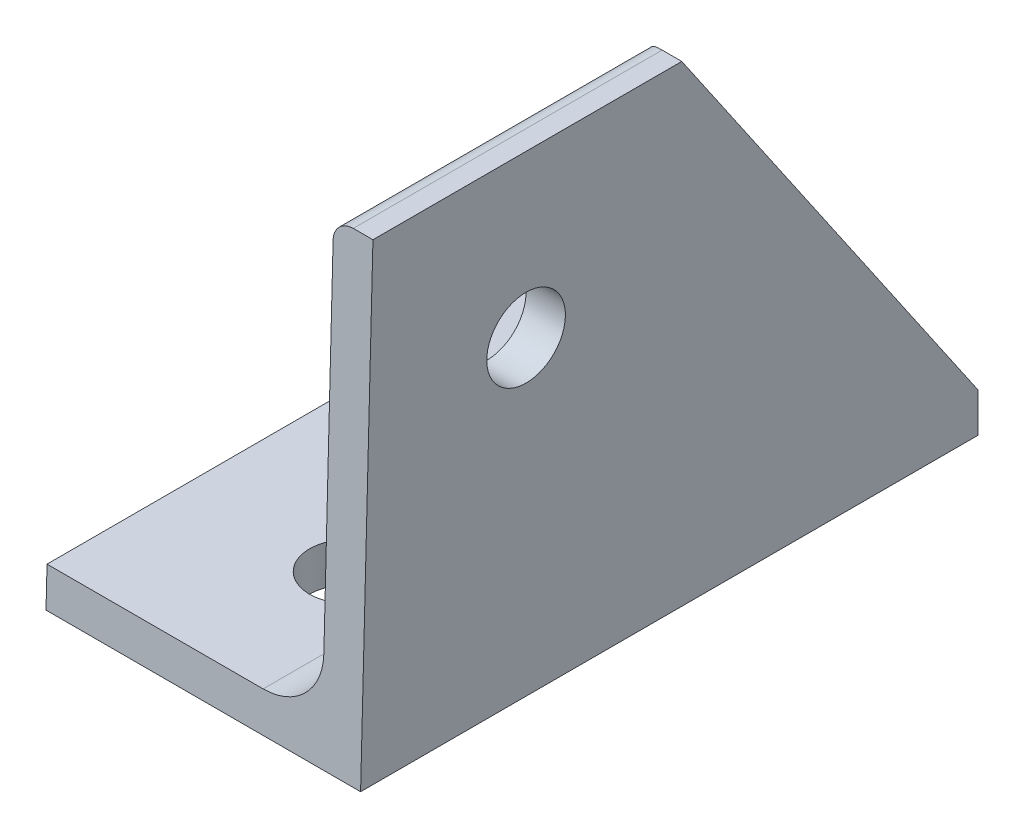
ISO-10303-21;
HEADER;
FILE_DESCRIPTION(('STEP AP214'),'2;1');
FILE_NAME('part.step','',(''),(''),'','','');
FILE_SCHEMA(('AUTOMOTIVE_DESIGN { 1 0 10303 214 1 1 1 1 }'));
ENDSEC;
DATA;
#1=APPLICATION_CONTEXT('core data for automotive mechanical design processes');
#2=APPLICATION_PROTOCOL_DEFINITION('international standard','automotive_design',2000,#1);
#3=PRODUCT_CONTEXT('',#1,'mechanical');
#4=PRODUCT('Part','Part','',(#3));
#5=PRODUCT_RELATED_PRODUCT_CATEGORY('part','',(#4));
#6=PRODUCT_DEFINITION_FORMATION('','',#4);
#7=PRODUCT_DEFINITION_CONTEXT('part definition',#1,'design');
#8=PRODUCT_DEFINITION('design','',#6,#7);
#9=PRODUCT_DEFINITION_SHAPE('','',#8);
#10=(LENGTH_UNIT() NAMED_UNIT(*) SI_UNIT(.MILLI.,.METRE.));
#11=(NAMED_UNIT(*) PLANE_ANGLE_UNIT() SI_UNIT($,.RADIAN.));
#12=(NAMED_UNIT(*) SI_UNIT($,.STERADIAN.) SOLID_ANGLE_UNIT());
#13=UNCERTAINTY_MEASURE_WITH_UNIT(LENGTH_MEASURE(1.E-05),#10,'distance_accuracy_value','');
#14=(GEOMETRIC_REPRESENTATION_CONTEXT(3) GLOBAL_UNCERTAINTY_ASSIGNED_CONTEXT((#13)) GLOBAL_UNIT_ASSIGNED_CONTEXT((#10,
#11,#12)) REPRESENTATION_CONTEXT('',''));
#15=CARTESIAN_POINT('',(0.,0.,0.));
#16=DIRECTION('',(0.,0.,1.));
#17=DIRECTION('',(1.,0.,0.));
#18=AXIS2_PLACEMENT_3D('',#15,#16,#17);
#19=CARTESIAN_POINT('',(11.0998,-11.0998,25.4));
#20=DIRECTION('',(0.,0.,-1.));
#21=DIRECTION('',(-1.,0.,0.));
#22=AXIS2_PLACEMENT_3D('',#19,#20,#21);
#23=CYLINDRICAL_SURFACE('',#22,4.7752);
#24=CARTESIAN_POINT('',(11.0998,-15.875,-8.48551308460921));
#25=CARTESIAN_POINT('',(11.2357111678711,-15.8749607958703,-8.63863271083802));
#26=CARTESIAN_POINT('',(11.3640476477458,-15.8691996849909,-8.79823988287183));
#27=CARTESIAN_POINT('',(11.6044683584301,-15.8497967345363,-9.1286363206387));
#28=CARTESIAN_POINT('',(11.7165661058063,-15.8361614968117,-9.29941611275704));
#29=CARTESIAN_POINT('',(11.9236350085392,-15.8045617726995,-9.6506226799802));
#30=CARTESIAN_POINT('',(12.0186065582862,-15.7865973860279,-9.83104923281066));
#31=CARTESIAN_POINT('',(12.1907600045839,-15.7495425805541,-10.200107193315));
#32=CARTESIAN_POINT('',(12.2679412301489,-15.7304521193145,-10.3887389101386));
#33=CARTESIAN_POINT('',(12.3936213817966,-15.6967691857035,-10.7437138738769));
#34=CARTESIAN_POINT('',(12.4446903479384,-15.6819325225662,-10.9091292576411));
#35=CARTESIAN_POINT('',(12.5331929373582,-15.6550238870502,-11.2437825028225));
#36=CARTESIAN_POINT('',(12.5706282886737,-15.6429515643681,-11.4130198769191));
#37=CARTESIAN_POINT('',(12.6315035505426,-15.6227910942342,-11.7538881871343));
#38=CARTESIAN_POINT('',(12.6549708905553,-15.61469514375,-11.9255137503194));
#39=CARTESIAN_POINT('',(12.6878086575615,-15.6032507410658,-12.2702747659042));
#40=CARTESIAN_POINT('',(12.6971788470998,-15.5999023688349,-12.4434102436877));
#41=CARTESIAN_POINT('',(12.7017270775053,-15.5982853959638,-12.7898914718866));
#42=CARTESIAN_POINT('',(12.696905158404,-15.6000167809953,-12.9632372217074));
#43=CARTESIAN_POINT('',(12.6731181320052,-15.6083875972335,-13.3088349201236));
#44=CARTESIAN_POINT('',(12.6541527733028,-15.6150271156843,-13.4810868492209));
#45=CARTESIAN_POINT('',(12.6022138991968,-15.6325736391906,-13.8235538234178));
#46=CARTESIAN_POINT('',(12.5692153438454,-15.6434882697233,-13.9937646656111));
#47=CARTESIAN_POINT('',(12.4894888602921,-15.6685023777956,-14.3306891970083));
#48=CARTESIAN_POINT('',(12.4427611726205,-15.6826017995377,-14.4974029474254));
#49=CARTESIAN_POINT('',(12.3363262194501,-15.7124527944421,-14.8250515752677));
#50=CARTESIAN_POINT('',(12.2767211685287,-15.7281908781162,-14.9860209484218));
#51=CARTESIAN_POINT('',(12.144674394576,-15.7597762892197,-15.3026277456028));
#52=CARTESIAN_POINT('',(12.0722305554551,-15.775623634243,-15.458264285618));
#53=CARTESIAN_POINT('',(11.9151029571149,-15.8055620041383,-15.7629127722917));
#54=CARTESIAN_POINT('',(11.8304501317334,-15.8196573049611,-15.9119402526041));
#55=CARTESIAN_POINT('',(11.6492544101474,-15.844163346169,-16.2028173767018));
#56=CARTESIAN_POINT('',(11.5527190491874,-15.8545764055646,-16.3446714897266));
#57=CARTESIAN_POINT('',(11.3952906054384,-15.8661705537528,-16.5569614099106));
#58=CARTESIAN_POINT('',(11.3383913450767,-15.8693951869497,-16.6302750878716));
#59=CARTESIAN_POINT('',(11.2214388928702,-15.8738086580742,-16.7743328150349));
#60=CARTESIAN_POINT('',(11.1613875614351,-15.8749986832437,-16.8450783392082));
#61=CARTESIAN_POINT('',(11.0998,-15.875,-16.9144869153908));
#62=B_SPLINE_CURVE_WITH_KNOTS('',3,(#24,#25,#26,#27,#28,#29,#30,#31,#32,#33,#34,#35,#36,#37,#38,
#39,#40,#41,#42,#43,#44,#45,#46,#47,#48,#49,#50,#51,#52,#53,#54,#55,#56,#57,#58,#59,#60,#61),
.UNSPECIFIED.,.F.,.F.,(4,2,2,2,2,2,2,2,2,2,2,2,2,2,2,2,2,2,4),(0.,0.613649372772355,
1.22678499311274,1.83990649206569,2.45305111192113,2.97374489222339,3.49437265248971,
4.01397463607019,4.53358537183239,5.05319464193575,5.57281314850679,6.09336274560458,
6.61390322337106,7.13045448971822,7.64709097337797,8.16244073380393,8.67746535559926,
8.95594344265795,9.23425897565643),.UNSPECIFIED.);
#63=CARTESIAN_POINT('',(11.0998,-15.875,-8.48551308460923));
#64=VERTEX_POINT('',#63);
#65=CARTESIAN_POINT('',(11.0998,-15.875,-16.9144869153908));
#66=VERTEX_POINT('',#65);
#67=EDGE_CURVE('E125',#64,#66,#62,.T.);
#68=ORIENTED_EDGE('',*,*,#67,.F.);
#69=DIRECTION('',(0.,0.,-1.));
#70=VECTOR('',#69,1.);
#71=CARTESIAN_POINT('',(11.0998,-15.875,25.4));
#72=LINE('',#71,#70);
#73=CARTESIAN_POINT('',(11.0998,-15.875,8.48551308460923));
#74=VERTEX_POINT('',#73);
#75=EDGE_CURVE('E133',#74,#64,#72,.T.);
#76=ORIENTED_EDGE('',*,*,#75,.F.);
#77=CARTESIAN_POINT('',(11.0998,-15.875,16.9144869153908));
#78=CARTESIAN_POINT('',(11.2357111678711,-15.8749607958703,16.761367289162));
#79=CARTESIAN_POINT('',(11.3640476477459,-15.8691996849909,16.6017601171282));
#80=CARTESIAN_POINT('',(11.6044683584301,-15.8497967345363,16.2713636793613));
#81=CARTESIAN_POINT('',(11.7165661058063,-15.8361614968117,16.100583887243));
#82=CARTESIAN_POINT('',(11.9236350085392,-15.8045617726995,15.7493773200198));
#83=CARTESIAN_POINT('',(12.0186065582862,-15.7865973860279,15.5689507671893));
#84=CARTESIAN_POINT('',(12.1907600045839,-15.7495425805541,15.199892806685));
#85=CARTESIAN_POINT('',(12.2679412301489,-15.7304521193145,15.0112610898614));
#86=CARTESIAN_POINT('',(12.3936213817966,-15.6967691857035,14.6562861261231));
#87=CARTESIAN_POINT('',(12.4446903479384,-15.6819325225662,14.4908707423589));
#88=CARTESIAN_POINT('',(12.5331929373582,-15.6550238870502,14.1562174971775));
#89=CARTESIAN_POINT('',(12.5706282886737,-15.6429515643681,13.9869801230809));
#90=CARTESIAN_POINT('',(12.6315035505426,-15.6227910942342,13.6461118128657));
#91=CARTESIAN_POINT('',(12.6549708905553,-15.61469514375,13.4744862496806));
#92=CARTESIAN_POINT('',(12.6878086575615,-15.6032507410658,13.1297252340958));
#93=CARTESIAN_POINT('',(12.6971788470998,-15.5999023688349,12.9565897563123));
#94=CARTESIAN_POINT('',(12.7017270775053,-15.5982853959638,12.6101085281134));
#95=CARTESIAN_POINT('',(12.696905158404,-15.6000167809953,12.4367627782925));
#96=CARTESIAN_POINT('',(12.6731181320052,-15.6083875972335,12.0911650798764));
#97=CARTESIAN_POINT('',(12.6541527733028,-15.6150271156843,11.9189131507791));
#98=CARTESIAN_POINT('',(12.6022138991968,-15.6325736391906,11.5764461765822));
#99=CARTESIAN_POINT('',(12.5692153438454,-15.6434882697233,11.4062353343889));
#100=CARTESIAN_POINT('',(12.4894888602921,-15.6685023777956,11.0693108029917));
#101=CARTESIAN_POINT('',(12.4427611726205,-15.6826017995377,10.9025970525746));
#102=CARTESIAN_POINT('',(12.3363262194501,-15.7124527944421,10.5749484247323));
#103=CARTESIAN_POINT('',(12.2767211685287,-15.7281908781162,10.4139790515782));
#104=CARTESIAN_POINT('',(12.144674394576,-15.7597762892197,10.0973722543972));
#105=CARTESIAN_POINT('',(12.0722305554551,-15.775623634243,9.94173571438202));
#106=CARTESIAN_POINT('',(11.9151029571149,-15.8055620041383,9.63708722770828));
#107=CARTESIAN_POINT('',(11.8304501317333,-15.8196573049611,9.48805974739591));
#108=CARTESIAN_POINT('',(11.6492544101474,-15.844163346169,9.19718262329822));
#109=CARTESIAN_POINT('',(11.5527190491874,-15.8545764055646,9.05532851027338));
#110=CARTESIAN_POINT('',(11.3952906054384,-15.8661705537528,8.84303859008942));
#111=CARTESIAN_POINT('',(11.3383913450767,-15.8693951869497,8.76972491212838));
#112=CARTESIAN_POINT('',(11.2214388928702,-15.8738086580742,8.62566718496507));
#113=CARTESIAN_POINT('',(11.1613875614351,-15.8749986832437,8.55492166079179));
#114=CARTESIAN_POINT('',(11.0998,-15.875,8.48551308460922));
#115=B_SPLINE_CURVE_WITH_KNOTS('',3,(#77,#78,#79,#80,#81,#82,#83,#84,#85,#86,#87,#88,#89,#90,
#91,#92,#93,#94,#95,#96,#97,#98,#99,#100,#101,#102,#103,#104,#105,#106,#107,#108,#109,#110,#111,
#112,#113,#114),.UNSPECIFIED.,.F.,.F.,(4,2,2,2,2,2,2,2,2,2,2,2,2,2,2,2,2,2,4),(0.,
0.613649372772355,1.22678499311274,1.83990649206569,2.45305111192113,2.97374489222339,
3.49437265248971,4.01397463607019,4.53358537183239,5.05319464193575,5.57281314850679,
6.09336274560458,6.61390322337106,7.13045448971822,7.64709097337797,8.16244073380393,
8.67746535559927,8.95594344265795,9.23425897565643),.UNSPECIFIED.);
#116=CARTESIAN_POINT('',(11.0998,-15.875,16.9144869153908));
#117=VERTEX_POINT('',#116);
#118=EDGE_CURVE('E128',#117,#74,#115,.T.);
#119=ORIENTED_EDGE('',*,*,#118,.F.);
#120=CARTESIAN_POINT('',(11.0998,-15.875,24.3663781368268));
#121=VERTEX_POINT('',#120);
#122=EDGE_CURVE('E142',#121,#117,#72,.T.);
#123=ORIENTED_EDGE('',*,*,#122,.F.);
#124=CARTESIAN_POINT('',(11.0998,-11.0998,24.241335124149));
#125=DIRECTION('',(0.,0.0261769483079955,0.999657324975554));
#126=DIRECTION('',(0.,0.999657324975554,-0.0261769483079955));
#127=AXIS2_PLACEMENT_3D('',#124,#125,#126);
#128=ELLIPSE('',#127,4.77683690270241,4.7752);
#129=CARTESIAN_POINT('',(15.875,-11.0998,24.241335124149));
#130=VERTEX_POINT('',#129);
#131=EDGE_CURVE('E224',#130,#121,#128,.F.);
#132=ORIENTED_EDGE('',*,*,#131,.F.);
#133=DIRECTION('',(0.,0.,-1.));
#134=VECTOR('',#133,1.);
#135=CARTESIAN_POINT('',(15.875,-11.0998,25.4));
#136=LINE('',#135,#134);
#137=CARTESIAN_POINT('',(15.875,-11.0998,-22.130051963795));
#138=VERTEX_POINT('',#137);
#139=EDGE_CURVE('E146',#130,#138,#136,.T.);
#140=ORIENTED_EDGE('',*,*,#139,.T.);
#141=CARTESIAN_POINT('',(11.0998,-11.0998,-22.130051963795));
#142=DIRECTION('',(0.,0.565002335416394,-0.825089304847675));
#143=DIRECTION('',(0.,-0.825089304847675,-0.565002335416394));
#144=AXIS2_PLACEMENT_3D('',#141,#142,#143);
#145=ELLIPSE('',#144,5.78749472565467,4.7752);
#146=CARTESIAN_POINT('',(11.0998,-15.875,-25.4));
#147=VERTEX_POINT('',#146);
#148=EDGE_CURVE('E215',#147,#138,#145,.F.);
#149=ORIENTED_EDGE('',*,*,#148,.F.);
#150=EDGE_CURVE('E135',#66,#147,#72,.T.);
#151=ORIENTED_EDGE('',*,*,#150,.F.);
#152=EDGE_LOOP('',(#68,#76,#119,#123,#132,#140,#149,#151));
#153=FACE_BOUND('',#152,.T.);
#154=ADVANCED_FACE('F45',(#153),#23,.F.);
#155=CARTESIAN_POINT('',(-19.05,-19.05,25.4));
#156=DIRECTION('',(0.,1.,0.));
#157=DIRECTION('',(-1.,0.,0.));
#158=AXIS2_PLACEMENT_3D('',#155,#156,#157);
#159=PLANE('',#158);
#160=CARTESIAN_POINT('',(6.35000000000001,-19.05,12.7));
#161=DIRECTION('',(0.,-1.,0.));
#162=DIRECTION('',(1.,0.,0.));
#163=AXIS2_PLACEMENT_3D('',#160,#161,#162);
#164=CIRCLE('',#163,3.175);
#165=CARTESIAN_POINT('',(9.52500000000001,-19.05,12.7));
#166=VERTEX_POINT('',#165);
#167=EDGE_CURVE('E197',#166,#166,#164,.T.);
#168=ORIENTED_EDGE('',*,*,#167,.F.);
#169=EDGE_LOOP('',(#168));
#170=FACE_BOUND('',#169,.T.);
#171=CARTESIAN_POINT('',(6.35000000000001,-19.05,-12.7));
#172=DIRECTION('',(0.,-1.,0.));
#173=DIRECTION('',(1.,0.,0.));
#174=AXIS2_PLACEMENT_3D('',#171,#172,#173);
#175=CIRCLE('',#174,3.175);
#176=CARTESIAN_POINT('',(9.52500000000001,-19.05,-12.7));
#177=VERTEX_POINT('',#176);
#178=EDGE_CURVE('E201',#177,#177,#175,.T.);
#179=ORIENTED_EDGE('',*,*,#178,.F.);
#180=EDGE_LOOP('',(#179));
#181=FACE_BOUND('',#180,.T.);
#182=DIRECTION('',(1.,0.,0.));
#183=VECTOR('',#182,1.);
#184=CARTESIAN_POINT('',(-6.35,-19.05,24.4495184378094));
#185=LINE('',#184,#183);
#186=CARTESIAN_POINT('',(-6.35,-19.05,24.4495184378094));
#187=VERTEX_POINT('',#186);
#188=CARTESIAN_POINT('',(19.05,-19.05,24.4495184378094));
#189=VERTEX_POINT('',#188);
#190=EDGE_CURVE('E239',#187,#189,#185,.T.);
#191=ORIENTED_EDGE('',*,*,#190,.F.);
#192=DIRECTION('',(0.,0.,1.));
#193=VECTOR('',#192,1.);
#194=CARTESIAN_POINT('',(-6.35,-19.05,25.4));
#195=LINE('',#194,#193);
#196=CARTESIAN_POINT('',(-6.34999999999999,-19.05,-25.4));
#197=VERTEX_POINT('',#196);
#198=EDGE_CURVE('E202',#197,#187,#195,.T.);
#199=ORIENTED_EDGE('',*,*,#198,.F.);
#200=DIRECTION('',(1.,0.,0.));
#201=VECTOR('',#200,1.);
#202=CARTESIAN_POINT('',(-19.05,-19.05,-25.4));
#203=LINE('',#202,#201);
#204=CARTESIAN_POINT('',(19.05,-19.05,-25.4));
#205=VERTEX_POINT('',#204);
#206=EDGE_CURVE('E179',#197,#205,#203,.T.);
#207=ORIENTED_EDGE('',*,*,#206,.T.);
#208=DIRECTION('',(0.,0.,-1.));
#209=VECTOR('',#208,1.);
#210=CARTESIAN_POINT('',(19.05,-19.05,25.4));
#211=LINE('',#210,#209);
#212=EDGE_CURVE('E166',#189,#205,#211,.T.);
#213=ORIENTED_EDGE('',*,*,#212,.F.);
#214=EDGE_LOOP('',(#191,#199,#207,#213));
#215=FACE_BOUND('',#214,.T.);
#216=ADVANCED_FACE('F47',(#170,#181,#215),#159,.F.);
#217=CARTESIAN_POINT('',(19.05,-19.05,25.4));
#218=DIRECTION('',(-1.,0.,0.));
#219=DIRECTION('',(0.,-1.,0.));
#220=AXIS2_PLACEMENT_3D('',#217,#218,#219);
#221=PLANE('',#220);
#222=CARTESIAN_POINT('',(19.05,6.02190472929893,11.0886340423407));
#223=DIRECTION('',(1.,0.,0.));
#224=DIRECTION('',(0.,1.,0.));
#225=AXIS2_PLACEMENT_3D('',#222,#223,#224);
#226=CIRCLE('',#225,3.175);
#227=CARTESIAN_POINT('',(19.05,9.19690472929893,11.0886340423407));
#228=VERTEX_POINT('',#227);
#229=EDGE_CURVE('E137',#228,#228,#226,.T.);
#230=ORIENTED_EDGE('',*,*,#229,.F.);
#231=EDGE_LOOP('',(#230));
#232=FACE_BOUND('',#231,.T.);
#233=DIRECTION('',(0.,0.825089304847675,0.565002335416394));
#234=VECTOR('',#233,1.);
#235=CARTESIAN_POINT('',(19.05,19.05,-1.48415665009674));
#236=LINE('',#235,#234);
#237=CARTESIAN_POINT('',(19.05,-15.875,-25.4));
#238=VERTEX_POINT('',#237);
#239=CARTESIAN_POINT('',(19.05,19.05,-1.48415665009674));
#240=VERTEX_POINT('',#239);
#241=EDGE_CURVE('E248',#238,#240,#236,.T.);
#242=ORIENTED_EDGE('',*,*,#241,.T.);
#243=DIRECTION('',(0.,0.,-1.));
#244=VECTOR('',#243,1.);
#245=CARTESIAN_POINT('',(19.05,19.05,25.4));
#246=LINE('',#245,#244);
#247=CARTESIAN_POINT('',(19.05,19.05,23.4518348260187));
#248=VERTEX_POINT('',#247);
#249=EDGE_CURVE('E162',#248,#240,#246,.T.);
#250=ORIENTED_EDGE('',*,*,#249,.F.);
#251=DIRECTION('',(0.,-0.999657324975554,0.0261769483079955));
#252=VECTOR('',#251,1.);
#253=CARTESIAN_POINT('',(19.05,19.05,23.4518348260187));
#254=LINE('',#253,#252);
#255=EDGE_CURVE('E235',#248,#189,#254,.T.);
#256=ORIENTED_EDGE('',*,*,#255,.T.);
#257=ORIENTED_EDGE('',*,*,#212,.T.);
#258=DIRECTION('',(0.,1.,0.));
#259=VECTOR('',#258,1.);
#260=CARTESIAN_POINT('',(19.05,-19.05,-25.4));
#261=LINE('',#260,#259);
#262=EDGE_CURVE('E184',#205,#238,#261,.T.);
#263=ORIENTED_EDGE('',*,*,#262,.T.);
#264=EDGE_LOOP('',(#242,#250,#256,#257,#263));
#265=FACE_BOUND('',#264,.T.);
#266=ADVANCED_FACE('F316',(#232,#265),#221,.F.);
#267=CARTESIAN_POINT('',(17.4625,19.05,25.4));
#268=DIRECTION('',(0.,-1.,0.));
#269=DIRECTION('',(1.,0.,0.));
#270=AXIS2_PLACEMENT_3D('',#267,#268,#269);
#271=PLANE('',#270);
#272=DIRECTION('',(1.,0.,0.));
#273=VECTOR('',#272,1.);
#274=CARTESIAN_POINT('',(-6.35,19.05,-1.48415665009674));
#275=LINE('',#274,#273);
#276=CARTESIAN_POINT('',(17.4625,19.05,-1.48415665009674));
#277=VERTEX_POINT('',#276);
#278=EDGE_CURVE('E231',#277,#240,#275,.T.);
#279=ORIENTED_EDGE('',*,*,#278,.F.);
#280=DIRECTION('',(0.,0.,-1.));
#281=VECTOR('',#280,1.);
#282=CARTESIAN_POINT('',(17.4625,19.05,25.4));
#283=LINE('',#282,#281);
#284=CARTESIAN_POINT('',(17.4625,19.05,23.4518348260187));
#285=VERTEX_POINT('',#284);
#286=EDGE_CURVE('E158',#285,#277,#283,.T.);
#287=ORIENTED_EDGE('',*,*,#286,.F.);
#288=DIRECTION('',(1.,0.,0.));
#289=VECTOR('',#288,1.);
#290=CARTESIAN_POINT('',(-6.35,19.05,23.4518348260187));
#291=LINE('',#290,#289);
#292=EDGE_CURVE('E234',#285,#248,#291,.T.);
#293=ORIENTED_EDGE('',*,*,#292,.T.);
#294=ORIENTED_EDGE('',*,*,#249,.T.);
#295=EDGE_LOOP('',(#279,#287,#293,#294));
#296=FACE_BOUND('',#295,.T.);
#297=ADVANCED_FACE('F321',(#296),#271,.F.);
#298=CARTESIAN_POINT('',(17.4625,17.4625,25.4));
#299=DIRECTION('',(0.,0.,-1.));
#300=DIRECTION('',(-1.,0.,0.));
#301=AXIS2_PLACEMENT_3D('',#298,#299,#300);
#302=CYLINDRICAL_SURFACE('',#301,1.5875);
#303=CARTESIAN_POINT('',(17.4625,17.4625,-2.57124043872871));
#304=DIRECTION('',(0.,0.565002335416394,-0.825089304847675));
#305=DIRECTION('',(0.,-0.825089304847675,-0.565002335416394));
#306=AXIS2_PLACEMENT_3D('',#303,#304,#305);
#307=ELLIPSE('',#306,1.92403415081605,1.5875);
#308=CARTESIAN_POINT('',(15.875,17.4625,-2.5712404387287));
#309=VERTEX_POINT('',#308);
#310=EDGE_CURVE('E206',#309,#277,#307,.T.);
#311=ORIENTED_EDGE('',*,*,#310,.F.);
#312=DIRECTION('',(0.,0.,-1.));
#313=VECTOR('',#312,1.);
#314=CARTESIAN_POINT('',(15.875,17.4625,25.4));
#315=LINE('',#314,#313);
#316=CARTESIAN_POINT('',(15.875,17.4625,23.49340497651));
#317=VERTEX_POINT('',#316);
#318=EDGE_CURVE('E154',#317,#309,#315,.T.);
#319=ORIENTED_EDGE('',*,*,#318,.F.);
#320=CARTESIAN_POINT('',(17.4625,17.4625,23.49340497651));
#321=DIRECTION('',(0.,0.0261769483079955,0.999657324975554));
#322=DIRECTION('',(0.,0.999657324975554,-0.0261769483079955));
#323=AXIS2_PLACEMENT_3D('',#320,#321,#322);
#324=ELLIPSE('',#323,1.58804418307926,1.5875);
#325=EDGE_CURVE('E218',#285,#317,#324,.T.);
#326=ORIENTED_EDGE('',*,*,#325,.F.);
#327=ORIENTED_EDGE('',*,*,#286,.T.);
#328=EDGE_LOOP('',(#311,#319,#326,#327));
#329=FACE_BOUND('',#328,.T.);
#330=ADVANCED_FACE('F310',(#329),#302,.T.);
#331=CARTESIAN_POINT('',(15.875,17.4625,25.4));
#332=DIRECTION('',(1.,0.,0.));
#333=DIRECTION('',(0.,1.,0.));
#334=AXIS2_PLACEMENT_3D('',#331,#332,#333);
#335=PLANE('',#334);
#336=CARTESIAN_POINT('',(15.875,6.02190472929893,11.0886340423407));
#337=DIRECTION('',(1.,0.,0.));
#338=DIRECTION('',(0.,1.,0.));
#339=AXIS2_PLACEMENT_3D('',#336,#337,#338);
#340=CIRCLE('',#339,3.175);
#341=CARTESIAN_POINT('',(15.875,9.19690472929893,11.0886340423407));
#342=VERTEX_POINT('',#341);
#343=EDGE_CURVE('E49',#342,#342,#340,.T.);
#344=ORIENTED_EDGE('',*,*,#343,.T.);
#345=EDGE_LOOP('',(#344));
#346=FACE_BOUND('',#345,.T.);
#347=DIRECTION('',(0.,0.825089304847675,0.565002335416394));
#348=VECTOR('',#347,1.);
#349=CARTESIAN_POINT('',(15.875,30.5020596996055,6.35795260715467));
#350=LINE('',#349,#348);
#351=EDGE_CURVE('E212',#138,#309,#350,.T.);
#352=ORIENTED_EDGE('',*,*,#351,.F.);
#353=ORIENTED_EDGE('',*,*,#139,.F.);
#354=DIRECTION('',(0.,-0.999657324975554,0.0261769483079955));
#355=VECTOR('',#354,1.);
#356=CARTESIAN_POINT('',(15.875,17.4126082631386,23.4947114376184));
#357=LINE('',#356,#355);
#358=EDGE_CURVE('E221',#317,#130,#357,.T.);
#359=ORIENTED_EDGE('',*,*,#358,.F.);
#360=ORIENTED_EDGE('',*,*,#318,.T.);
#361=EDGE_LOOP('',(#352,#353,#359,#360));
#362=FACE_BOUND('',#361,.T.);
#363=ADVANCED_FACE('F305',(#346,#362),#335,.F.);
#364=CARTESIAN_POINT('',(11.0998,-15.875,25.4));
#365=DIRECTION('',(0.,-1.,0.));
#366=DIRECTION('',(1.,0.,0.));
#367=AXIS2_PLACEMENT_3D('',#364,#365,#366);
#368=PLANE('',#367);
#369=ORIENTED_EDGE('',*,*,#75,.T.);
#370=CARTESIAN_POINT('',(6.35000000000001,-15.875,-12.7));
#371=DIRECTION('',(0.,1.,0.));
#372=DIRECTION('',(-1.,0.,0.));
#373=AXIS2_PLACEMENT_3D('',#370,#371,#372);
#374=CIRCLE('',#373,6.35);
#375=EDGE_CURVE('E62',#64,#66,#374,.T.);
#376=ORIENTED_EDGE('',*,*,#375,.T.);
#377=ORIENTED_EDGE('',*,*,#150,.T.);
#378=DIRECTION('',(-1.,0.,0.));
#379=VECTOR('',#378,1.);
#380=CARTESIAN_POINT('',(11.0998,-15.875,-25.4));
#381=LINE('',#380,#379);
#382=CARTESIAN_POINT('',(-6.34999999999999,-15.875,-25.4));
#383=VERTEX_POINT('',#382);
#384=EDGE_CURVE('E147',#147,#383,#381,.T.);
#385=ORIENTED_EDGE('',*,*,#384,.T.);
#386=DIRECTION('',(0.,0.,1.));
#387=VECTOR('',#386,1.);
#388=CARTESIAN_POINT('',(-6.35,-15.875,25.4));
#389=LINE('',#388,#387);
#390=CARTESIAN_POINT('',(-6.35,-15.875,24.3663781368268));
#391=VERTEX_POINT('',#390);
#392=EDGE_CURVE('E176',#383,#391,#389,.T.);
#393=ORIENTED_EDGE('',*,*,#392,.T.);
#394=DIRECTION('',(-1.,0.,0.));
#395=VECTOR('',#394,1.);
#396=CARTESIAN_POINT('',(11.0998,-15.875,24.3663781368268));
#397=LINE('',#396,#395);
#398=EDGE_CURVE('E227',#121,#391,#397,.T.);
#399=ORIENTED_EDGE('',*,*,#398,.F.);
#400=ORIENTED_EDGE('',*,*,#122,.T.);
#401=CARTESIAN_POINT('',(6.35000000000001,-15.875,12.7));
#402=DIRECTION('',(0.,1.,0.));
#403=DIRECTION('',(-1.,0.,0.));
#404=AXIS2_PLACEMENT_3D('',#401,#402,#403);
#405=CIRCLE('',#404,6.35);
#406=EDGE_CURVE('E68',#117,#74,#405,.T.);
#407=ORIENTED_EDGE('',*,*,#406,.T.);
#408=EDGE_LOOP('',(#369,#376,#377,#385,#393,#399,#400,#407));
#409=FACE_BOUND('',#408,.T.);
#410=CARTESIAN_POINT('',(6.35000000000001,-15.875,12.7));
#411=DIRECTION('',(0.,-1.,0.));
#412=DIRECTION('',(1.,0.,0.));
#413=AXIS2_PLACEMENT_3D('',#410,#411,#412);
#414=CIRCLE('',#413,3.175);
#415=CARTESIAN_POINT('',(9.52500000000001,-15.875,12.7));
#416=VERTEX_POINT('',#415);
#417=EDGE_CURVE('E171',#416,#416,#414,.T.);
#418=ORIENTED_EDGE('',*,*,#417,.T.);
#419=EDGE_LOOP('',(#418));
#420=FACE_BOUND('',#419,.T.);
#421=CARTESIAN_POINT('',(6.35000000000001,-15.875,-12.7));
#422=DIRECTION('',(0.,-1.,0.));
#423=DIRECTION('',(1.,0.,0.));
#424=AXIS2_PLACEMENT_3D('',#421,#422,#423);
#425=CIRCLE('',#424,3.175);
#426=CARTESIAN_POINT('',(9.52500000000001,-15.875,-12.7));
#427=VERTEX_POINT('',#426);
#428=EDGE_CURVE('E175',#427,#427,#425,.T.);
#429=ORIENTED_EDGE('',*,*,#428,.T.);
#430=EDGE_LOOP('',(#429));
#431=FACE_BOUND('',#430,.T.);
#432=ADVANCED_FACE('F139',(#409,#420,#431),#368,.F.);
#433=CARTESIAN_POINT('',(17.4625,17.4625,-25.4));
#434=DIRECTION('',(0.,0.,-1.));
#435=DIRECTION('',(-1.,0.,0.));
#436=AXIS2_PLACEMENT_3D('',#433,#434,#435);
#437=PLANE('',#436);
#438=ORIENTED_EDGE('',*,*,#384,.F.);
#439=DIRECTION('',(1.,0.,0.));
#440=VECTOR('',#439,1.);
#441=CARTESIAN_POINT('',(-6.35,-15.875,-25.4));
#442=LINE('',#441,#440);
#443=EDGE_CURVE('E230',#147,#238,#442,.T.);
#444=ORIENTED_EDGE('',*,*,#443,.T.);
#445=ORIENTED_EDGE('',*,*,#262,.F.);
#446=ORIENTED_EDGE('',*,*,#206,.F.);
#447=DIRECTION('',(0.,-1.,0.));
#448=VECTOR('',#447,1.);
#449=CARTESIAN_POINT('',(-6.34999999999999,17.4625,-25.4));
#450=LINE('',#449,#448);
#451=EDGE_CURVE('E55',#383,#197,#450,.T.);
#452=ORIENTED_EDGE('',*,*,#451,.F.);
#453=EDGE_LOOP('',(#438,#444,#445,#446,#452));
#454=FACE_BOUND('',#453,.T.);
#455=ADVANCED_FACE('F297',(#454),#437,.T.);
#456=CARTESIAN_POINT('',(-6.35,19.05,25.4));
#457=DIRECTION('',(1.,0.,0.));
#458=DIRECTION('',(0.,0.,-1.));
#459=AXIS2_PLACEMENT_3D('',#456,#457,#458);
#460=PLANE('',#459);
#461=DIRECTION('',(0.,-0.999657324975554,0.0261769483079955));
#462=VECTOR('',#461,1.);
#463=CARTESIAN_POINT('',(-6.35,18.99902045635,23.4531697723503));
#464=LINE('',#463,#462);
#465=EDGE_CURVE('E12',#391,#187,#464,.T.);
#466=ORIENTED_EDGE('',*,*,#465,.F.);
#467=ORIENTED_EDGE('',*,*,#392,.F.);
#468=ORIENTED_EDGE('',*,*,#451,.T.);
#469=ORIENTED_EDGE('',*,*,#198,.T.);
#470=EDGE_LOOP('',(#466,#467,#468,#469));
#471=FACE_BOUND('',#470,.T.);
#472=ADVANCED_FACE('F294',(#471),#460,.F.);
#473=CARTESIAN_POINT('',(6.35,19.05,12.7));
#474=DIRECTION('',(0.,-1.,0.));
#475=DIRECTION('',(1.,0.,0.));
#476=AXIS2_PLACEMENT_3D('',#473,#474,#475);
#477=CYLINDRICAL_SURFACE('',#476,3.175);
#478=ORIENTED_EDGE('',*,*,#167,.T.);
#479=EDGE_LOOP('',(#478));
#480=FACE_BOUND('',#479,.T.);
#481=ORIENTED_EDGE('',*,*,#417,.F.);
#482=EDGE_LOOP('',(#481));
#483=FACE_BOUND('',#482,.T.);
#484=ADVANCED_FACE('F292',(#480,#483),#477,.F.);
#485=CARTESIAN_POINT('',(6.35000000000001,19.05,-12.7));
#486=DIRECTION('',(0.,-1.,0.));
#487=DIRECTION('',(1.,0.,0.));
#488=AXIS2_PLACEMENT_3D('',#485,#486,#487);
#489=CYLINDRICAL_SURFACE('',#488,3.175);
#490=ORIENTED_EDGE('',*,*,#178,.T.);
#491=EDGE_LOOP('',(#490));
#492=FACE_BOUND('',#491,.T.);
#493=ORIENTED_EDGE('',*,*,#428,.F.);
#494=EDGE_LOOP('',(#493));
#495=FACE_BOUND('',#494,.T.);
#496=ADVANCED_FACE('F285',(#492,#495),#489,.F.);
#497=CARTESIAN_POINT('',(-6.35,19.05,23.4518348260187));
#498=DIRECTION('',(0.,0.0261769483079955,0.999657324975554));
#499=DIRECTION('',(0.,-0.999657324975554,0.0261769483079955));
#500=AXIS2_PLACEMENT_3D('',#497,#498,#499);
#501=PLANE('',#500);
#502=ORIENTED_EDGE('',*,*,#325,.T.);
#503=ORIENTED_EDGE('',*,*,#358,.T.);
#504=ORIENTED_EDGE('',*,*,#131,.T.);
#505=ORIENTED_EDGE('',*,*,#398,.T.);
#506=ORIENTED_EDGE('',*,*,#465,.T.);
#507=ORIENTED_EDGE('',*,*,#190,.T.);
#508=ORIENTED_EDGE('',*,*,#255,.F.);
#509=ORIENTED_EDGE('',*,*,#292,.F.);
#510=EDGE_LOOP('',(#502,#503,#504,#505,#506,#507,#508,#509));
#511=FACE_BOUND('',#510,.T.);
#512=ADVANCED_FACE('F282',(#511),#501,.T.);
#513=CARTESIAN_POINT('',(-6.35,19.05,-1.48415665009674));
#514=DIRECTION('',(0.,0.565002335416394,-0.825089304847675));
#515=DIRECTION('',(0.,0.825089304847675,0.565002335416394));
#516=AXIS2_PLACEMENT_3D('',#513,#514,#515);
#517=PLANE('',#516);
#518=ORIENTED_EDGE('',*,*,#310,.T.);
#519=ORIENTED_EDGE('',*,*,#278,.T.);
#520=ORIENTED_EDGE('',*,*,#241,.F.);
#521=ORIENTED_EDGE('',*,*,#443,.F.);
#522=ORIENTED_EDGE('',*,*,#148,.T.);
#523=ORIENTED_EDGE('',*,*,#351,.T.);
#524=EDGE_LOOP('',(#518,#519,#520,#521,#522,#523));
#525=FACE_BOUND('',#524,.T.);
#526=ADVANCED_FACE('F280',(#525),#517,.T.);
#527=CARTESIAN_POINT('',(-6.35,6.02190472929892,11.0886340423407));
#528=DIRECTION('',(1.,0.,0.));
#529=DIRECTION('',(0.,1.,0.));
#530=AXIS2_PLACEMENT_3D('',#527,#528,#529);
#531=CYLINDRICAL_SURFACE('',#530,3.175);
#532=ORIENTED_EDGE('',*,*,#229,.T.);
#533=EDGE_LOOP('',(#532));
#534=FACE_BOUND('',#533,.T.);
#535=ORIENTED_EDGE('',*,*,#343,.F.);
#536=EDGE_LOOP('',(#535));
#537=FACE_BOUND('',#536,.T.);
#538=ADVANCED_FACE('F276',(#534,#537),#531,.F.);
#539=CARTESIAN_POINT('',(6.35000000000001,-13.335,12.7));
#540=DIRECTION('',(0.,-1.,0.));
#541=DIRECTION('',(1.,0.,0.));
#542=AXIS2_PLACEMENT_3D('',#539,#540,#541);
#543=CYLINDRICAL_SURFACE('',#542,6.35);
#544=ORIENTED_EDGE('',*,*,#118,.T.);
#545=ORIENTED_EDGE('',*,*,#406,.F.);
#546=EDGE_LOOP('',(#544,#545));
#547=FACE_BOUND('',#546,.T.);
#548=ADVANCED_FACE('F272',(#547),#543,.F.);
#549=CARTESIAN_POINT('',(6.35000000000001,-13.335,-12.7));
#550=DIRECTION('',(0.,-1.,0.));
#551=DIRECTION('',(1.,0.,0.));
#552=AXIS2_PLACEMENT_3D('',#549,#550,#551);
#553=CYLINDRICAL_SURFACE('',#552,6.35);
#554=ORIENTED_EDGE('',*,*,#67,.T.);
#555=ORIENTED_EDGE('',*,*,#375,.F.);
#556=EDGE_LOOP('',(#554,#555));
#557=FACE_BOUND('',#556,.T.);
#558=ADVANCED_FACE('F124',(#557),#553,.F.);
#559=CLOSED_SHELL('',(#154,#216,#266,#297,#330,#363,#432,#455,#472,#484,#496,#512,#526,#538,
#548,#558));
#560=MANIFOLD_SOLID_BREP('B2',#559);
#561=ADVANCED_BREP_SHAPE_REPRESENTATION('',(#18,#560),#14);
#562=SHAPE_DEFINITION_REPRESENTATION(#9,#561);
ENDSEC;
END-ISO-10303-21;
